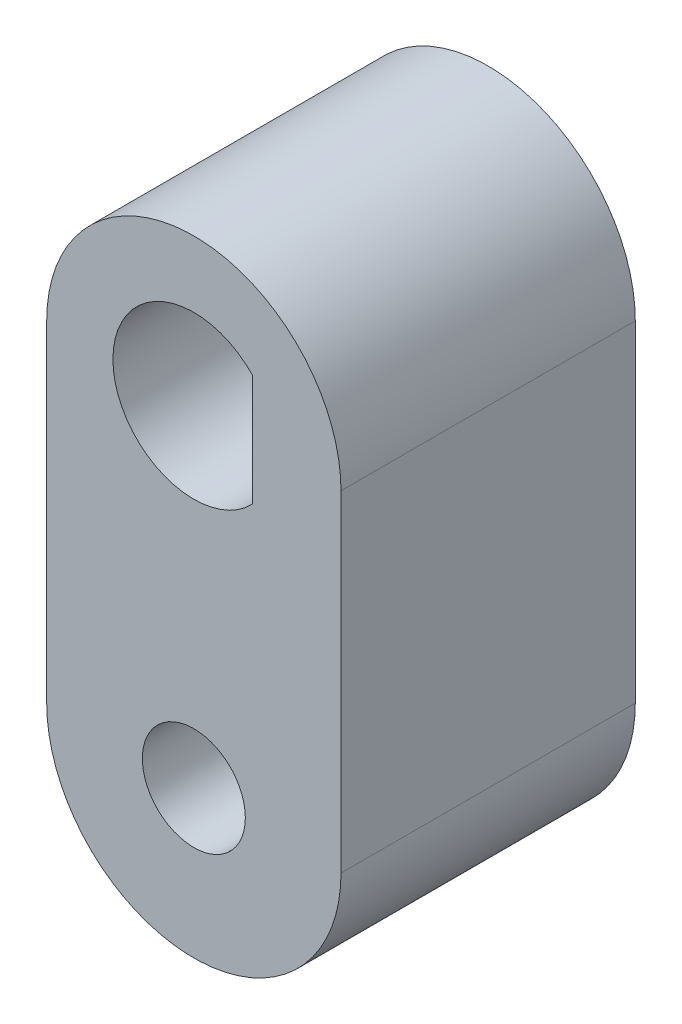
ISO-10303-21;
HEADER;
FILE_DESCRIPTION(('STEP AP214'),'2;1');
FILE_NAME('part.step','',(''),(''),'','','');
FILE_SCHEMA(('AUTOMOTIVE_DESIGN { 1 0 10303 214 1 1 1 1 }'));
ENDSEC;
DATA;
#1=APPLICATION_CONTEXT('core data for automotive mechanical design processes');
#2=APPLICATION_PROTOCOL_DEFINITION('international standard','automotive_design',2000,#1);
#3=PRODUCT_CONTEXT('',#1,'mechanical');
#4=PRODUCT('Part','Part','',(#3));
#5=PRODUCT_RELATED_PRODUCT_CATEGORY('part','',(#4));
#6=PRODUCT_DEFINITION_FORMATION('','',#4);
#7=PRODUCT_DEFINITION_CONTEXT('part definition',#1,'design');
#8=PRODUCT_DEFINITION('design','',#6,#7);
#9=PRODUCT_DEFINITION_SHAPE('','',#8);
#10=(LENGTH_UNIT() NAMED_UNIT(*) SI_UNIT(.MILLI.,.METRE.));
#11=(NAMED_UNIT(*) PLANE_ANGLE_UNIT() SI_UNIT($,.RADIAN.));
#12=(NAMED_UNIT(*) SI_UNIT($,.STERADIAN.) SOLID_ANGLE_UNIT());
#13=UNCERTAINTY_MEASURE_WITH_UNIT(LENGTH_MEASURE(1.E-05),#10,'distance_accuracy_value','');
#14=(GEOMETRIC_REPRESENTATION_CONTEXT(3) GLOBAL_UNCERTAINTY_ASSIGNED_CONTEXT((#13)) GLOBAL_UNIT_ASSIGNED_CONTEXT((#10,
#11,#12)) REPRESENTATION_CONTEXT('',''));
#15=CARTESIAN_POINT('',(0.,0.,0.));
#16=DIRECTION('',(0.,0.,1.));
#17=DIRECTION('',(1.,0.,0.));
#18=AXIS2_PLACEMENT_3D('',#15,#16,#17);
#19=CARTESIAN_POINT('',(0.,0.,8.));
#20=DIRECTION('',(0.,0.,1.));
#21=DIRECTION('',(1.,0.,0.));
#22=AXIS2_PLACEMENT_3D('',#19,#20,#21);
#23=PLANE('',#22);
#24=CARTESIAN_POINT('',(0.,0.,8.));
#25=DIRECTION('',(0.,0.,1.));
#26=DIRECTION('',(1.,0.,0.));
#27=AXIS2_PLACEMENT_3D('',#24,#25,#26);
#28=CIRCLE('',#27,4.);
#29=CARTESIAN_POINT('',(4.,0.,8.));
#30=VERTEX_POINT('',#29);
#31=CARTESIAN_POINT('',(-4.,0.,8.));
#32=VERTEX_POINT('',#31);
#33=EDGE_CURVE('E108',#30,#32,#28,.T.);
#34=ORIENTED_EDGE('',*,*,#33,.T.);
#35=DIRECTION('',(0.,-1.,0.));
#36=VECTOR('',#35,1.);
#37=CARTESIAN_POINT('',(-4.,0.,8.));
#38=LINE('',#37,#36);
#39=CARTESIAN_POINT('',(-4.,-9.,8.));
#40=VERTEX_POINT('',#39);
#41=EDGE_CURVE('E111',#32,#40,#38,.T.);
#42=ORIENTED_EDGE('',*,*,#41,.T.);
#43=CARTESIAN_POINT('',(0.,-9.,8.));
#44=DIRECTION('',(0.,0.,1.));
#45=DIRECTION('',(1.,0.,0.));
#46=AXIS2_PLACEMENT_3D('',#43,#44,#45);
#47=CIRCLE('',#46,4.);
#48=CARTESIAN_POINT('',(4.,-9.,8.));
#49=VERTEX_POINT('',#48);
#50=EDGE_CURVE('E114',#40,#49,#47,.T.);
#51=ORIENTED_EDGE('',*,*,#50,.T.);
#52=DIRECTION('',(0.,-1.,0.));
#53=VECTOR('',#52,1.);
#54=CARTESIAN_POINT('',(4.,0.,8.));
#55=LINE('',#54,#53);
#56=EDGE_CURVE('E116',#30,#49,#55,.T.);
#57=ORIENTED_EDGE('',*,*,#56,.F.);
#58=EDGE_LOOP('',(#34,#42,#51,#57));
#59=FACE_BOUND('',#58,.T.);
#60=CARTESIAN_POINT('',(0.,-9.,8.));
#61=DIRECTION('',(0.,0.,1.));
#62=DIRECTION('',(1.,0.,0.));
#63=AXIS2_PLACEMENT_3D('',#60,#61,#62);
#64=CIRCLE('',#63,1.4);
#65=CARTESIAN_POINT('',(1.4,-9.,8.));
#66=VERTEX_POINT('',#65);
#67=EDGE_CURVE('E105',#66,#66,#64,.T.);
#68=ORIENTED_EDGE('',*,*,#67,.F.);
#69=EDGE_LOOP('',(#68));
#70=FACE_BOUND('',#69,.T.);
#71=DIRECTION('',(0.,-1.,0.));
#72=VECTOR('',#71,1.);
#73=CARTESIAN_POINT('',(1.6,0.,8.));
#74=LINE('',#73,#72);
#75=CARTESIAN_POINT('',(1.6,1.50996688705415,8.));
#76=VERTEX_POINT('',#75);
#77=CARTESIAN_POINT('',(1.6,-1.50996688705415,8.));
#78=VERTEX_POINT('',#77);
#79=EDGE_CURVE('E48',#76,#78,#74,.T.);
#80=ORIENTED_EDGE('',*,*,#79,.T.);
#81=CARTESIAN_POINT('',(0.,0.,8.));
#82=DIRECTION('',(0.,0.,1.));
#83=DIRECTION('',(1.,0.,0.));
#84=AXIS2_PLACEMENT_3D('',#81,#82,#83);
#85=CIRCLE('',#84,2.2);
#86=EDGE_CURVE('E85',#76,#78,#85,.T.);
#87=ORIENTED_EDGE('',*,*,#86,.F.);
#88=EDGE_LOOP('',(#80,#87));
#89=FACE_BOUND('',#88,.T.);
#90=ADVANCED_FACE('F33',(#59,#70,#89),#23,.T.);
#91=CARTESIAN_POINT('',(0.,0.,0.));
#92=DIRECTION('',(0.,0.,1.));
#93=DIRECTION('',(1.,0.,0.));
#94=AXIS2_PLACEMENT_3D('',#91,#92,#93);
#95=PLANE('',#94);
#96=CARTESIAN_POINT('',(0.,-9.,0.));
#97=DIRECTION('',(0.,0.,1.));
#98=DIRECTION('',(1.,0.,0.));
#99=AXIS2_PLACEMENT_3D('',#96,#97,#98);
#100=CIRCLE('',#99,1.4);
#101=CARTESIAN_POINT('',(1.4,-9.,0.));
#102=VERTEX_POINT('',#101);
#103=EDGE_CURVE('E99',#102,#102,#100,.T.);
#104=ORIENTED_EDGE('',*,*,#103,.T.);
#105=EDGE_LOOP('',(#104));
#106=FACE_BOUND('',#105,.T.);
#107=CARTESIAN_POINT('',(0.,0.,0.));
#108=DIRECTION('',(0.,0.,1.));
#109=DIRECTION('',(1.,0.,0.));
#110=AXIS2_PLACEMENT_3D('',#107,#108,#109);
#111=CIRCLE('',#110,4.);
#112=CARTESIAN_POINT('',(4.,0.,0.));
#113=VERTEX_POINT('',#112);
#114=CARTESIAN_POINT('',(-4.,0.,0.));
#115=VERTEX_POINT('',#114);
#116=EDGE_CURVE('E102',#113,#115,#111,.T.);
#117=ORIENTED_EDGE('',*,*,#116,.F.);
#118=DIRECTION('',(0.,-1.,0.));
#119=VECTOR('',#118,1.);
#120=CARTESIAN_POINT('',(4.,0.,0.));
#121=LINE('',#120,#119);
#122=CARTESIAN_POINT('',(4.,-9.,0.));
#123=VERTEX_POINT('',#122);
#124=EDGE_CURVE('E112',#113,#123,#121,.T.);
#125=ORIENTED_EDGE('',*,*,#124,.T.);
#126=CARTESIAN_POINT('',(0.,-9.,0.));
#127=DIRECTION('',(0.,0.,1.));
#128=DIRECTION('',(1.,0.,0.));
#129=AXIS2_PLACEMENT_3D('',#126,#127,#128);
#130=CIRCLE('',#129,4.);
#131=CARTESIAN_POINT('',(-4.,-9.,0.));
#132=VERTEX_POINT('',#131);
#133=EDGE_CURVE('E124',#132,#123,#130,.T.);
#134=ORIENTED_EDGE('',*,*,#133,.F.);
#135=DIRECTION('',(0.,-1.,0.));
#136=VECTOR('',#135,1.);
#137=CARTESIAN_POINT('',(-4.,0.,0.));
#138=LINE('',#137,#136);
#139=EDGE_CURVE('E122',#115,#132,#138,.T.);
#140=ORIENTED_EDGE('',*,*,#139,.F.);
#141=EDGE_LOOP('',(#117,#125,#134,#140));
#142=FACE_BOUND('',#141,.T.);
#143=CARTESIAN_POINT('',(0.,0.,0.));
#144=DIRECTION('',(0.,0.,1.));
#145=DIRECTION('',(1.,0.,0.));
#146=AXIS2_PLACEMENT_3D('',#143,#144,#145);
#147=CIRCLE('',#146,2.2);
#148=CARTESIAN_POINT('',(1.6,1.50996688705415,0.));
#149=VERTEX_POINT('',#148);
#150=CARTESIAN_POINT('',(1.6,-1.50996688705415,0.));
#151=VERTEX_POINT('',#150);
#152=EDGE_CURVE('E95',#149,#151,#147,.T.);
#153=ORIENTED_EDGE('',*,*,#152,.T.);
#154=DIRECTION('',(0.,-1.,0.));
#155=VECTOR('',#154,1.);
#156=CARTESIAN_POINT('',(1.6,0.,0.));
#157=LINE('',#156,#155);
#158=EDGE_CURVE('E53',#149,#151,#157,.T.);
#159=ORIENTED_EDGE('',*,*,#158,.F.);
#160=EDGE_LOOP('',(#153,#159));
#161=FACE_BOUND('',#160,.T.);
#162=ADVANCED_FACE('F141',(#106,#142,#161),#95,.F.);
#163=CARTESIAN_POINT('',(0.,0.,8.));
#164=DIRECTION('',(0.,0.,-1.));
#165=DIRECTION('',(-1.,0.,0.));
#166=AXIS2_PLACEMENT_3D('',#163,#164,#165);
#167=CYLINDRICAL_SURFACE('',#166,4.);
#168=ORIENTED_EDGE('',*,*,#116,.T.);
#169=DIRECTION('',(0.,0.,-1.));
#170=VECTOR('',#169,1.);
#171=CARTESIAN_POINT('',(-4.,0.,8.));
#172=LINE('',#171,#170);
#173=EDGE_CURVE('E11',#32,#115,#172,.T.);
#174=ORIENTED_EDGE('',*,*,#173,.F.);
#175=ORIENTED_EDGE('',*,*,#33,.F.);
#176=DIRECTION('',(0.,0.,-1.));
#177=VECTOR('',#176,1.);
#178=CARTESIAN_POINT('',(4.,0.,8.));
#179=LINE('',#178,#177);
#180=EDGE_CURVE('E119',#30,#113,#179,.T.);
#181=ORIENTED_EDGE('',*,*,#180,.T.);
#182=EDGE_LOOP('',(#168,#174,#175,#181));
#183=FACE_BOUND('',#182,.T.);
#184=ADVANCED_FACE('F35',(#183),#167,.T.);
#185=CARTESIAN_POINT('',(-4.,0.,8.));
#186=DIRECTION('',(1.,0.,0.));
#187=DIRECTION('',(0.,1.,0.));
#188=AXIS2_PLACEMENT_3D('',#185,#186,#187);
#189=PLANE('',#188);
#190=ORIENTED_EDGE('',*,*,#139,.T.);
#191=DIRECTION('',(0.,0.,-1.));
#192=VECTOR('',#191,1.);
#193=CARTESIAN_POINT('',(-4.,-9.,8.));
#194=LINE('',#193,#192);
#195=EDGE_CURVE('E41',#40,#132,#194,.T.);
#196=ORIENTED_EDGE('',*,*,#195,.F.);
#197=ORIENTED_EDGE('',*,*,#41,.F.);
#198=ORIENTED_EDGE('',*,*,#173,.T.);
#199=EDGE_LOOP('',(#190,#196,#197,#198));
#200=FACE_BOUND('',#199,.T.);
#201=ADVANCED_FACE('F151',(#200),#189,.F.);
#202=CARTESIAN_POINT('',(0.,-9.,8.));
#203=DIRECTION('',(0.,0.,-1.));
#204=DIRECTION('',(-1.,0.,0.));
#205=AXIS2_PLACEMENT_3D('',#202,#203,#204);
#206=CYLINDRICAL_SURFACE('',#205,4.);
#207=ORIENTED_EDGE('',*,*,#133,.T.);
#208=DIRECTION('',(0.,0.,-1.));
#209=VECTOR('',#208,1.);
#210=CARTESIAN_POINT('',(4.,-9.,8.));
#211=LINE('',#210,#209);
#212=EDGE_CURVE('E130',#49,#123,#211,.T.);
#213=ORIENTED_EDGE('',*,*,#212,.F.);
#214=ORIENTED_EDGE('',*,*,#50,.F.);
#215=ORIENTED_EDGE('',*,*,#195,.T.);
#216=EDGE_LOOP('',(#207,#213,#214,#215));
#217=FACE_BOUND('',#216,.T.);
#218=ADVANCED_FACE('F136',(#217),#206,.T.);
#219=CARTESIAN_POINT('',(4.,0.,8.));
#220=DIRECTION('',(1.,0.,0.));
#221=DIRECTION('',(0.,1.,0.));
#222=AXIS2_PLACEMENT_3D('',#219,#220,#221);
#223=PLANE('',#222);
#224=ORIENTED_EDGE('',*,*,#124,.F.);
#225=ORIENTED_EDGE('',*,*,#180,.F.);
#226=ORIENTED_EDGE('',*,*,#56,.T.);
#227=ORIENTED_EDGE('',*,*,#212,.T.);
#228=EDGE_LOOP('',(#224,#225,#226,#227));
#229=FACE_BOUND('',#228,.T.);
#230=ADVANCED_FACE('F145',(#229),#223,.T.);
#231=CARTESIAN_POINT('',(0.,-9.,8.));
#232=DIRECTION('',(0.,0.,-1.));
#233=DIRECTION('',(-1.,0.,0.));
#234=AXIS2_PLACEMENT_3D('',#231,#232,#233);
#235=CYLINDRICAL_SURFACE('',#234,1.4);
#236=ORIENTED_EDGE('',*,*,#67,.T.);
#237=EDGE_LOOP('',(#236));
#238=FACE_BOUND('',#237,.T.);
#239=ORIENTED_EDGE('',*,*,#103,.F.);
#240=EDGE_LOOP('',(#239));
#241=FACE_BOUND('',#240,.T.);
#242=ADVANCED_FACE('F165',(#238,#241),#235,.F.);
#243=CARTESIAN_POINT('',(1.6,0.,8.));
#244=DIRECTION('',(1.,0.,0.));
#245=DIRECTION('',(0.,0.,-1.));
#246=AXIS2_PLACEMENT_3D('',#243,#244,#245);
#247=PLANE('',#246);
#248=ORIENTED_EDGE('',*,*,#158,.T.);
#249=DIRECTION('',(0.,0.,-1.));
#250=VECTOR('',#249,1.);
#251=CARTESIAN_POINT('',(1.6,-1.50996688705415,8.));
#252=LINE('',#251,#250);
#253=EDGE_CURVE('E88',#78,#151,#252,.T.);
#254=ORIENTED_EDGE('',*,*,#253,.F.);
#255=ORIENTED_EDGE('',*,*,#79,.F.);
#256=DIRECTION('',(0.,0.,-1.));
#257=VECTOR('',#256,1.);
#258=CARTESIAN_POINT('',(1.6,1.50996688705415,8.));
#259=LINE('',#258,#257);
#260=EDGE_CURVE('E90',#76,#149,#259,.T.);
#261=ORIENTED_EDGE('',*,*,#260,.T.);
#262=EDGE_LOOP('',(#248,#254,#255,#261));
#263=FACE_BOUND('',#262,.T.);
#264=ADVANCED_FACE('F93',(#263),#247,.F.);
#265=CARTESIAN_POINT('',(0.,0.,8.));
#266=DIRECTION('',(0.,0.,-1.));
#267=DIRECTION('',(-1.,0.,0.));
#268=AXIS2_PLACEMENT_3D('',#265,#266,#267);
#269=CYLINDRICAL_SURFACE('',#268,2.2);
#270=ORIENTED_EDGE('',*,*,#152,.F.);
#271=ORIENTED_EDGE('',*,*,#260,.F.);
#272=ORIENTED_EDGE('',*,*,#86,.T.);
#273=ORIENTED_EDGE('',*,*,#253,.T.);
#274=EDGE_LOOP('',(#270,#271,#272,#273));
#275=FACE_BOUND('',#274,.T.);
#276=ADVANCED_FACE('F87',(#275),#269,.F.);
#277=CLOSED_SHELL('',(#90,#162,#184,#201,#218,#230,#242,#264,#276));
#278=MANIFOLD_SOLID_BREP('B2',#277);
#279=ADVANCED_BREP_SHAPE_REPRESENTATION('',(#18,#278),#14);
#280=SHAPE_DEFINITION_REPRESENTATION(#9,#279);
ENDSEC;
END-ISO-10303-21;
